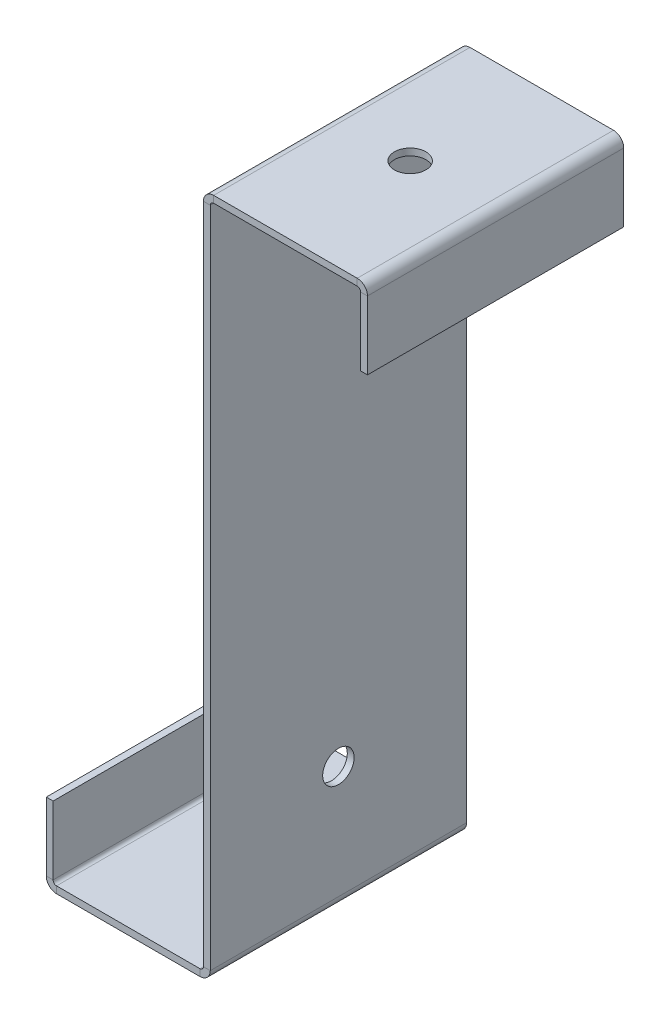
ISO-10303-21;
HEADER;
FILE_DESCRIPTION(('STEP AP214'),'2;1');
FILE_NAME('part.step','',(''),(''),'','','');
FILE_SCHEMA(('AUTOMOTIVE_DESIGN { 1 0 10303 214 1 1 1 1 }'));
ENDSEC;
DATA;
#1=APPLICATION_CONTEXT('core data for automotive mechanical design processes');
#2=APPLICATION_PROTOCOL_DEFINITION('international standard','automotive_design',2000,#1);
#3=PRODUCT_CONTEXT('',#1,'mechanical');
#4=PRODUCT('Part','Part','',(#3));
#5=PRODUCT_RELATED_PRODUCT_CATEGORY('part','',(#4));
#6=PRODUCT_DEFINITION_FORMATION('','',#4);
#7=PRODUCT_DEFINITION_CONTEXT('part definition',#1,'design');
#8=PRODUCT_DEFINITION('design','',#6,#7);
#9=PRODUCT_DEFINITION_SHAPE('','',#8);
#10=(LENGTH_UNIT() NAMED_UNIT(*) SI_UNIT(.MILLI.,.METRE.));
#11=(NAMED_UNIT(*) PLANE_ANGLE_UNIT() SI_UNIT($,.RADIAN.));
#12=(NAMED_UNIT(*) SI_UNIT($,.STERADIAN.) SOLID_ANGLE_UNIT());
#13=UNCERTAINTY_MEASURE_WITH_UNIT(LENGTH_MEASURE(1.E-05),#10,'distance_accuracy_value','');
#14=(GEOMETRIC_REPRESENTATION_CONTEXT(3) GLOBAL_UNCERTAINTY_ASSIGNED_CONTEXT((#13)) GLOBAL_UNIT_ASSIGNED_CONTEXT((#10,
#11,#12)) REPRESENTATION_CONTEXT('',''));
#15=CARTESIAN_POINT('',(0.,0.,0.));
#16=DIRECTION('',(0.,0.,1.));
#17=DIRECTION('',(1.,0.,0.));
#18=AXIS2_PLACEMENT_3D('',#15,#16,#17);
#19=CARTESIAN_POINT('',(-1.99999999999999,-100.,37.5));
#20=DIRECTION('',(0.,0.,1.));
#21=DIRECTION('',(1.,0.,0.));
#22=AXIS2_PLACEMENT_3D('',#19,#20,#21);
#23=PLANE('',#22);
#24=DIRECTION('',(-1.,0.,0.));
#25=VECTOR('',#24,1.);
#26=CARTESIAN_POINT('',(3.56372540173496E-13,-98.,37.5));
#27=LINE('',#26,#25);
#28=CARTESIAN_POINT('',(-45.,-98.0000000000001,37.5));
#29=VERTEX_POINT('',#28);
#30=CARTESIAN_POINT('',(-3.,-98.,37.5));
#31=VERTEX_POINT('',#30);
#32=EDGE_CURVE('E379',#29,#31,#27,.F.);
#33=ORIENTED_EDGE('',*,*,#32,.F.);
#34=DIRECTION('',(0.,-1.,0.));
#35=VECTOR('',#34,1.);
#36=CARTESIAN_POINT('',(-45.,-98.0000000000001,37.5));
#37=LINE('',#36,#35);
#38=CARTESIAN_POINT('',(-45.,-100.,37.5));
#39=VERTEX_POINT('',#38);
#40=EDGE_CURVE('E309',#29,#39,#37,.T.);
#41=ORIENTED_EDGE('',*,*,#40,.T.);
#42=DIRECTION('',(1.,0.,0.));
#43=VECTOR('',#42,1.);
#44=CARTESIAN_POINT('',(-1.99999999999999,-100.,37.5));
#45=LINE('',#44,#43);
#46=CARTESIAN_POINT('',(-3.,-100.,37.5));
#47=VERTEX_POINT('',#46);
#48=EDGE_CURVE('E373',#39,#47,#45,.T.);
#49=ORIENTED_EDGE('',*,*,#48,.T.);
#50=DIRECTION('',(0.,-1.,0.));
#51=VECTOR('',#50,1.);
#52=CARTESIAN_POINT('',(-3.,-98.,37.5));
#53=LINE('',#52,#51);
#54=EDGE_CURVE('E387',#31,#47,#53,.T.);
#55=ORIENTED_EDGE('',*,*,#54,.F.);
#56=EDGE_LOOP('',(#33,#41,#49,#55));
#57=FACE_BOUND('',#56,.T.);
#58=ADVANCED_FACE('F119',(#57),#23,.T.);
#59=CARTESIAN_POINT('',(3.69012209838063E-13,-100.,0.));
#60=DIRECTION('',(0.,-1.,0.));
#61=DIRECTION('',(1.,0.,0.));
#62=AXIS2_PLACEMENT_3D('',#59,#60,#61);
#63=PLANE('',#62);
#64=CARTESIAN_POINT('',(-23.,-100.,0.));
#65=DIRECTION('',(0.,-1.,0.));
#66=DIRECTION('',(1.,0.,0.));
#67=AXIS2_PLACEMENT_3D('',#64,#65,#66);
#68=CIRCLE('',#67,4.6);
#69=CARTESIAN_POINT('',(-18.4,-100.,0.));
#70=VERTEX_POINT('',#69);
#71=EDGE_CURVE('E1007',#70,#70,#68,.T.);
#72=ORIENTED_EDGE('',*,*,#71,.F.);
#73=EDGE_LOOP('',(#72));
#74=FACE_BOUND('',#73,.T.);
#75=ORIENTED_EDGE('',*,*,#48,.F.);
#76=DIRECTION('',(0.,0.,1.));
#77=VECTOR('',#76,1.);
#78=CARTESIAN_POINT('',(-45.,-100.,37.5));
#79=LINE('',#78,#77);
#80=CARTESIAN_POINT('',(-45.,-100.,-37.5));
#81=VERTEX_POINT('',#80);
#82=EDGE_CURVE('E264',#39,#81,#79,.F.);
#83=ORIENTED_EDGE('',*,*,#82,.T.);
#84=DIRECTION('',(-1.,0.,0.));
#85=VECTOR('',#84,1.);
#86=CARTESIAN_POINT('',(-48.,-100.,-37.5));
#87=LINE('',#86,#85);
#88=CARTESIAN_POINT('',(-3.,-100.,-37.5));
#89=VERTEX_POINT('',#88);
#90=EDGE_CURVE('E376',#89,#81,#87,.T.);
#91=ORIENTED_EDGE('',*,*,#90,.F.);
#92=DIRECTION('',(0.,0.,1.));
#93=VECTOR('',#92,1.);
#94=CARTESIAN_POINT('',(-3.,-100.,0.));
#95=LINE('',#94,#93);
#96=EDGE_CURVE('E384',#89,#47,#95,.T.);
#97=ORIENTED_EDGE('',*,*,#96,.T.);
#98=EDGE_LOOP('',(#75,#83,#91,#97));
#99=FACE_BOUND('',#98,.T.);
#100=ADVANCED_FACE('F549',(#74,#99),#63,.T.);
#101=CARTESIAN_POINT('',(3.62029247160377E-13,-98.,0.));
#102=DIRECTION('',(0.,-1.,0.));
#103=DIRECTION('',(1.,0.,0.));
#104=AXIS2_PLACEMENT_3D('',#101,#102,#103);
#105=PLANE('',#104);
#106=CARTESIAN_POINT('',(-23.,-98.0000000000001,0.));
#107=DIRECTION('',(0.,1.,0.));
#108=DIRECTION('',(-1.,0.,0.));
#109=AXIS2_PLACEMENT_3D('',#106,#107,#108);
#110=CIRCLE('',#109,4.6);
#111=CARTESIAN_POINT('',(-27.6,-98.0000000000001,0.));
#112=VERTEX_POINT('',#111);
#113=EDGE_CURVE('E992',#112,#112,#110,.T.);
#114=ORIENTED_EDGE('',*,*,#113,.F.);
#115=EDGE_LOOP('',(#114));
#116=FACE_BOUND('',#115,.T.);
#117=DIRECTION('',(0.,0.,1.));
#118=VECTOR('',#117,1.);
#119=CARTESIAN_POINT('',(-45.,-98.0000000000001,37.5));
#120=LINE('',#119,#118);
#121=CARTESIAN_POINT('',(-45.,-98.0000000000001,-37.5));
#122=VERTEX_POINT('',#121);
#123=EDGE_CURVE('E313',#29,#122,#120,.F.);
#124=ORIENTED_EDGE('',*,*,#123,.F.);
#125=ORIENTED_EDGE('',*,*,#32,.T.);
#126=DIRECTION('',(0.,0.,-1.));
#127=VECTOR('',#126,1.);
#128=CARTESIAN_POINT('',(-3.,-98.,-37.5));
#129=LINE('',#128,#127);
#130=CARTESIAN_POINT('',(-3.,-98.,-37.5));
#131=VERTEX_POINT('',#130);
#132=EDGE_CURVE('E390',#131,#31,#129,.F.);
#133=ORIENTED_EDGE('',*,*,#132,.F.);
#134=DIRECTION('',(1.,0.,0.));
#135=VECTOR('',#134,1.);
#136=CARTESIAN_POINT('',(3.67685954147258E-13,-98.,-37.5));
#137=LINE('',#136,#135);
#138=EDGE_CURVE('E381',#131,#122,#137,.F.);
#139=ORIENTED_EDGE('',*,*,#138,.T.);
#140=EDGE_LOOP('',(#124,#125,#133,#139));
#141=FACE_BOUND('',#140,.T.);
#142=ADVANCED_FACE('F572',(#116,#141),#105,.F.);
#143=CARTESIAN_POINT('',(0.,100.,-37.5));
#144=DIRECTION('',(0.,0.,1.));
#145=DIRECTION('',(1.,0.,0.));
#146=AXIS2_PLACEMENT_3D('',#143,#144,#145);
#147=PLANE('',#146);
#148=DIRECTION('',(0.,1.,0.));
#149=VECTOR('',#148,1.);
#150=CARTESIAN_POINT('',(43.,98.0000000000001,-37.5));
#151=LINE('',#150,#149);
#152=CARTESIAN_POINT('',(43.,98.0000000000001,-37.5));
#153=VERTEX_POINT('',#152);
#154=CARTESIAN_POINT('',(43.,100.,-37.5));
#155=VERTEX_POINT('',#154);
#156=EDGE_CURVE('E367',#153,#155,#151,.T.);
#157=ORIENTED_EDGE('',*,*,#156,.F.);
#158=DIRECTION('',(1.,0.,0.));
#159=VECTOR('',#158,1.);
#160=CARTESIAN_POINT('',(0.,98.,-37.5));
#161=LINE('',#160,#159);
#162=CARTESIAN_POINT('',(1.,98.,-37.5));
#163=VERTEX_POINT('',#162);
#164=EDGE_CURVE('E425',#153,#163,#161,.F.);
#165=ORIENTED_EDGE('',*,*,#164,.T.);
#166=DIRECTION('',(0.,-1.,0.));
#167=VECTOR('',#166,1.);
#168=CARTESIAN_POINT('',(0.999999999999994,100.,-37.5));
#169=LINE('',#168,#167);
#170=CARTESIAN_POINT('',(0.999999999999994,100.,-37.5));
#171=VERTEX_POINT('',#170);
#172=EDGE_CURVE('E415',#163,#171,#169,.F.);
#173=ORIENTED_EDGE('',*,*,#172,.T.);
#174=DIRECTION('',(-1.,0.,0.));
#175=VECTOR('',#174,1.);
#176=CARTESIAN_POINT('',(-3.74668916824944E-13,100.,-37.5));
#177=LINE('',#176,#175);
#178=EDGE_CURVE('E421',#155,#171,#177,.T.);
#179=ORIENTED_EDGE('',*,*,#178,.F.);
#180=EDGE_LOOP('',(#157,#165,#173,#179));
#181=FACE_BOUND('',#180,.T.);
#182=ADVANCED_FACE('F517',(#181),#147,.F.);
#183=CARTESIAN_POINT('',(46.,100.,37.5));
#184=DIRECTION('',(0.,0.,-1.));
#185=DIRECTION('',(-1.,0.,0.));
#186=AXIS2_PLACEMENT_3D('',#183,#184,#185);
#187=PLANE('',#186);
#188=DIRECTION('',(0.,1.,0.));
#189=VECTOR('',#188,1.);
#190=CARTESIAN_POINT('',(43.,98.0000000000001,37.5));
#191=LINE('',#190,#189);
#192=CARTESIAN_POINT('',(43.,98.0000000000002,37.5));
#193=VERTEX_POINT('',#192);
#194=CARTESIAN_POINT('',(43.,100.,37.5));
#195=VERTEX_POINT('',#194);
#196=EDGE_CURVE('E358',#193,#195,#191,.T.);
#197=ORIENTED_EDGE('',*,*,#196,.T.);
#198=DIRECTION('',(1.,0.,0.));
#199=VECTOR('',#198,1.);
#200=CARTESIAN_POINT('',(-3.69012209838063E-13,100.,37.5));
#201=LINE('',#200,#199);
#202=CARTESIAN_POINT('',(0.999999999999994,100.,37.5));
#203=VERTEX_POINT('',#202);
#204=EDGE_CURVE('E418',#203,#195,#201,.T.);
#205=ORIENTED_EDGE('',*,*,#204,.F.);
#206=DIRECTION('',(0.,-1.,0.));
#207=VECTOR('',#206,1.);
#208=CARTESIAN_POINT('',(1.,98.,37.5));
#209=LINE('',#208,#207);
#210=CARTESIAN_POINT('',(1.,98.,37.5));
#211=VERTEX_POINT('',#210);
#212=EDGE_CURVE('E430',#211,#203,#209,.F.);
#213=ORIENTED_EDGE('',*,*,#212,.F.);
#214=DIRECTION('',(-1.,0.,0.));
#215=VECTOR('',#214,1.);
#216=CARTESIAN_POINT('',(46.,98.0000000000002,37.5));
#217=LINE('',#216,#215);
#218=EDGE_CURVE('E423',#211,#193,#217,.F.);
#219=ORIENTED_EDGE('',*,*,#218,.T.);
#220=EDGE_LOOP('',(#197,#205,#213,#219));
#221=FACE_BOUND('',#220,.T.);
#222=ADVANCED_FACE('F482',(#221),#187,.F.);
#223=CARTESIAN_POINT('',(-3.69012209838063E-13,100.,0.));
#224=DIRECTION('',(0.,-1.,0.));
#225=DIRECTION('',(1.,0.,0.));
#226=AXIS2_PLACEMENT_3D('',#223,#224,#225);
#227=PLANE('',#226);
#228=CARTESIAN_POINT('',(21.,100.,0.));
#229=DIRECTION('',(0.,1.,0.));
#230=DIRECTION('',(-1.,0.,0.));
#231=AXIS2_PLACEMENT_3D('',#228,#229,#230);
#232=CIRCLE('',#231,4.6);
#233=CARTESIAN_POINT('',(16.4,100.,0.));
#234=VERTEX_POINT('',#233);
#235=EDGE_CURVE('E1004',#234,#234,#232,.T.);
#236=ORIENTED_EDGE('',*,*,#235,.F.);
#237=EDGE_LOOP('',(#236));
#238=FACE_BOUND('',#237,.T.);
#239=DIRECTION('',(0.,0.,1.));
#240=VECTOR('',#239,1.);
#241=CARTESIAN_POINT('',(43.,100.,37.5));
#242=LINE('',#241,#240);
#243=EDGE_CURVE('E352',#195,#155,#242,.F.);
#244=ORIENTED_EDGE('',*,*,#243,.T.);
#245=ORIENTED_EDGE('',*,*,#178,.T.);
#246=DIRECTION('',(0.,0.,1.));
#247=VECTOR('',#246,1.);
#248=CARTESIAN_POINT('',(0.999999999999994,100.,-37.5));
#249=LINE('',#248,#247);
#250=EDGE_CURVE('E427',#203,#171,#249,.F.);
#251=ORIENTED_EDGE('',*,*,#250,.F.);
#252=ORIENTED_EDGE('',*,*,#204,.T.);
#253=EDGE_LOOP('',(#244,#245,#251,#252));
#254=FACE_BOUND('',#253,.T.);
#255=ADVANCED_FACE('F521',(#238,#254),#227,.F.);
#256=CARTESIAN_POINT('',(-3.62029247160377E-13,98.,0.));
#257=DIRECTION('',(0.,-1.,0.));
#258=DIRECTION('',(1.,0.,0.));
#259=AXIS2_PLACEMENT_3D('',#256,#257,#258);
#260=PLANE('',#259);
#261=CARTESIAN_POINT('',(21.,98.0000000000001,0.));
#262=DIRECTION('',(0.,-1.,0.));
#263=DIRECTION('',(1.,0.,0.));
#264=AXIS2_PLACEMENT_3D('',#261,#262,#263);
#265=CIRCLE('',#264,4.6);
#266=CARTESIAN_POINT('',(25.6,98.0000000000001,0.));
#267=VERTEX_POINT('',#266);
#268=EDGE_CURVE('E123',#267,#267,#265,.T.);
#269=ORIENTED_EDGE('',*,*,#268,.F.);
#270=EDGE_LOOP('',(#269));
#271=FACE_BOUND('',#270,.T.);
#272=ORIENTED_EDGE('',*,*,#164,.F.);
#273=DIRECTION('',(0.,0.,1.));
#274=VECTOR('',#273,1.);
#275=CARTESIAN_POINT('',(43.,98.0000000000001,37.5));
#276=LINE('',#275,#274);
#277=EDGE_CURVE('E144',#193,#153,#276,.F.);
#278=ORIENTED_EDGE('',*,*,#277,.F.);
#279=ORIENTED_EDGE('',*,*,#218,.F.);
#280=DIRECTION('',(0.,0.,1.));
#281=VECTOR('',#280,1.);
#282=CARTESIAN_POINT('',(1.,98.,-37.5));
#283=LINE('',#282,#281);
#284=EDGE_CURVE('E433',#163,#211,#283,.T.);
#285=ORIENTED_EDGE('',*,*,#284,.F.);
#286=EDGE_LOOP('',(#272,#278,#279,#285));
#287=FACE_BOUND('',#286,.T.);
#288=ADVANCED_FACE('F479',(#271,#287),#260,.T.);
#289=CARTESIAN_POINT('',(-2.,100.,37.5));
#290=DIRECTION('',(0.,0.,1.));
#291=DIRECTION('',(0.,-1.,0.));
#292=AXIS2_PLACEMENT_3D('',#289,#290,#291);
#293=PLANE('',#292);
#294=DIRECTION('',(0.,-1.,0.));
#295=VECTOR('',#294,1.);
#296=CARTESIAN_POINT('',(-2.,100.,37.5));
#297=LINE('',#296,#295);
#298=CARTESIAN_POINT('',(-2.,97.,37.5));
#299=VERTEX_POINT('',#298);
#300=CARTESIAN_POINT('',(-2.00000000000001,-97.,37.5));
#301=VERTEX_POINT('',#300);
#302=EDGE_CURVE('E13',#299,#301,#297,.T.);
#303=ORIENTED_EDGE('',*,*,#302,.T.);
#304=DIRECTION('',(1.,0.,0.));
#305=VECTOR('',#304,1.);
#306=CARTESIAN_POINT('',(-2.00000000000001,-97.,37.5));
#307=LINE('',#306,#305);
#308=CARTESIAN_POINT('',(0.,-97.,37.5));
#309=VERTEX_POINT('',#308);
#310=EDGE_CURVE('E402',#301,#309,#307,.T.);
#311=ORIENTED_EDGE('',*,*,#310,.T.);
#312=DIRECTION('',(0.,-1.,0.));
#313=VECTOR('',#312,1.);
#314=CARTESIAN_POINT('',(0.,100.,37.5));
#315=LINE('',#314,#313);
#316=CARTESIAN_POINT('',(0.,97.,37.5));
#317=VERTEX_POINT('',#316);
#318=EDGE_CURVE('E461',#317,#309,#315,.T.);
#319=ORIENTED_EDGE('',*,*,#318,.F.);
#320=DIRECTION('',(-1.,0.,0.));
#321=VECTOR('',#320,1.);
#322=CARTESIAN_POINT('',(0.,97.,37.5));
#323=LINE('',#322,#321);
#324=EDGE_CURVE('E444',#317,#299,#323,.T.);
#325=ORIENTED_EDGE('',*,*,#324,.T.);
#326=EDGE_LOOP('',(#303,#311,#319,#325));
#327=FACE_BOUND('',#326,.T.);
#328=ADVANCED_FACE('F469',(#327),#293,.T.);
#329=CARTESIAN_POINT('',(-2.,0.,0.));
#330=DIRECTION('',(1.,0.,0.));
#331=DIRECTION('',(0.,0.,-1.));
#332=AXIS2_PLACEMENT_3D('',#329,#330,#331);
#333=PLANE('',#332);
#334=CARTESIAN_POINT('',(-2.,-64.,0.));
#335=DIRECTION('',(1.,0.,0.));
#336=DIRECTION('',(0.,0.,-1.));
#337=AXIS2_PLACEMENT_3D('',#334,#335,#336);
#338=CIRCLE('',#337,4.6);
#339=CARTESIAN_POINT('',(-2.,-64.,-4.60000000000001));
#340=VERTEX_POINT('',#339);
#341=EDGE_CURVE('E1011',#340,#340,#338,.T.);
#342=ORIENTED_EDGE('',*,*,#341,.T.);
#343=EDGE_LOOP('',(#342));
#344=FACE_BOUND('',#343,.T.);
#345=DIRECTION('',(0.,0.,1.));
#346=VECTOR('',#345,1.);
#347=CARTESIAN_POINT('',(-2.00000000000001,-97.,37.5));
#348=LINE('',#347,#346);
#349=CARTESIAN_POINT('',(-2.00000000000001,-97.,-37.5));
#350=VERTEX_POINT('',#349);
#351=EDGE_CURVE('E408',#301,#350,#348,.F.);
#352=ORIENTED_EDGE('',*,*,#351,.F.);
#353=ORIENTED_EDGE('',*,*,#302,.F.);
#354=DIRECTION('',(0.,0.,1.));
#355=VECTOR('',#354,1.);
#356=CARTESIAN_POINT('',(-2.,97.,37.5));
#357=LINE('',#356,#355);
#358=CARTESIAN_POINT('',(-2.,97.,-37.5));
#359=VERTEX_POINT('',#358);
#360=EDGE_CURVE('E437',#299,#359,#357,.F.);
#361=ORIENTED_EDGE('',*,*,#360,.T.);
#362=DIRECTION('',(0.,1.,0.));
#363=VECTOR('',#362,1.);
#364=CARTESIAN_POINT('',(-2.,100.,-37.5));
#365=LINE('',#364,#363);
#366=EDGE_CURVE('E128',#350,#359,#365,.T.);
#367=ORIENTED_EDGE('',*,*,#366,.F.);
#368=EDGE_LOOP('',(#352,#353,#361,#367));
#369=FACE_BOUND('',#368,.T.);
#370=ADVANCED_FACE('F534',(#344,#369),#333,.F.);
#371=CARTESIAN_POINT('',(0.,0.,0.));
#372=DIRECTION('',(1.,0.,0.));
#373=DIRECTION('',(0.,0.,-1.));
#374=AXIS2_PLACEMENT_3D('',#371,#372,#373);
#375=PLANE('',#374);
#376=CARTESIAN_POINT('',(0.,-64.,0.));
#377=DIRECTION('',(1.,0.,0.));
#378=DIRECTION('',(0.,0.,-1.));
#379=AXIS2_PLACEMENT_3D('',#376,#377,#378);
#380=CIRCLE('',#379,4.6);
#381=CARTESIAN_POINT('',(0.,-64.,-4.60000000000001));
#382=VERTEX_POINT('',#381);
#383=EDGE_CURVE('E1014',#382,#382,#380,.T.);
#384=ORIENTED_EDGE('',*,*,#383,.F.);
#385=EDGE_LOOP('',(#384));
#386=FACE_BOUND('',#385,.T.);
#387=ORIENTED_EDGE('',*,*,#318,.T.);
#388=DIRECTION('',(0.,0.,1.));
#389=VECTOR('',#388,1.);
#390=CARTESIAN_POINT('',(0.,-97.,37.5));
#391=LINE('',#390,#389);
#392=CARTESIAN_POINT('',(0.,-97.,-37.5));
#393=VERTEX_POINT('',#392);
#394=EDGE_CURVE('E395',#309,#393,#391,.F.);
#395=ORIENTED_EDGE('',*,*,#394,.T.);
#396=DIRECTION('',(0.,1.,0.));
#397=VECTOR('',#396,1.);
#398=CARTESIAN_POINT('',(0.,100.,-37.5));
#399=LINE('',#398,#397);
#400=CARTESIAN_POINT('',(0.,97.,-37.5));
#401=VERTEX_POINT('',#400);
#402=EDGE_CURVE('E458',#393,#401,#399,.T.);
#403=ORIENTED_EDGE('',*,*,#402,.T.);
#404=DIRECTION('',(0.,0.,1.));
#405=VECTOR('',#404,1.);
#406=CARTESIAN_POINT('',(0.,97.,37.5));
#407=LINE('',#406,#405);
#408=EDGE_CURVE('E450',#317,#401,#407,.F.);
#409=ORIENTED_EDGE('',*,*,#408,.F.);
#410=EDGE_LOOP('',(#387,#395,#403,#409));
#411=FACE_BOUND('',#410,.T.);
#412=ADVANCED_FACE('F466',(#386,#411),#375,.T.);
#413=CARTESIAN_POINT('',(-2.,100.,-37.5));
#414=DIRECTION('',(0.,0.,-1.));
#415=DIRECTION('',(0.,1.,0.));
#416=AXIS2_PLACEMENT_3D('',#413,#414,#415);
#417=PLANE('',#416);
#418=DIRECTION('',(1.,0.,0.));
#419=VECTOR('',#418,1.);
#420=CARTESIAN_POINT('',(-2.00000000000001,-97.,-37.5));
#421=LINE('',#420,#419);
#422=EDGE_CURVE('E412',#350,#393,#421,.T.);
#423=ORIENTED_EDGE('',*,*,#422,.F.);
#424=ORIENTED_EDGE('',*,*,#366,.T.);
#425=DIRECTION('',(-1.,0.,0.));
#426=VECTOR('',#425,1.);
#427=CARTESIAN_POINT('',(0.,97.,-37.5));
#428=LINE('',#427,#426);
#429=EDGE_CURVE('E455',#401,#359,#428,.T.);
#430=ORIENTED_EDGE('',*,*,#429,.F.);
#431=ORIENTED_EDGE('',*,*,#402,.F.);
#432=EDGE_LOOP('',(#423,#424,#430,#431));
#433=FACE_BOUND('',#432,.T.);
#434=ADVANCED_FACE('F121',(#433),#417,.T.);
#435=CARTESIAN_POINT('',(1.,97.,-37.5));
#436=DIRECTION('',(0.,0.,-1.));
#437=DIRECTION('',(-1.,0.,0.));
#438=AXIS2_PLACEMENT_3D('',#435,#436,#437);
#439=PLANE('',#438);
#440=ORIENTED_EDGE('',*,*,#172,.F.);
#441=CARTESIAN_POINT('',(1.,97.,-37.5));
#442=DIRECTION('',(0.,0.,1.));
#443=DIRECTION('',(1.,0.,0.));
#444=AXIS2_PLACEMENT_3D('',#441,#442,#443);
#445=CIRCLE('',#444,1.);
#446=EDGE_CURVE('E447',#401,#163,#445,.F.);
#447=ORIENTED_EDGE('',*,*,#446,.F.);
#448=ORIENTED_EDGE('',*,*,#429,.T.);
#449=CARTESIAN_POINT('',(1.,97.,-37.5));
#450=DIRECTION('',(0.,0.,1.));
#451=DIRECTION('',(1.,0.,0.));
#452=AXIS2_PLACEMENT_3D('',#449,#450,#451);
#453=CIRCLE('',#452,3.);
#454=EDGE_CURVE('E440',#359,#171,#453,.F.);
#455=ORIENTED_EDGE('',*,*,#454,.T.);
#456=EDGE_LOOP('',(#440,#447,#448,#455));
#457=FACE_BOUND('',#456,.T.);
#458=ADVANCED_FACE('F526',(#457),#439,.T.);
#459=CARTESIAN_POINT('',(1.,97.,37.5));
#460=DIRECTION('',(0.,0.,-1.));
#461=DIRECTION('',(-1.,0.,0.));
#462=AXIS2_PLACEMENT_3D('',#459,#460,#461);
#463=PLANE('',#462);
#464=CARTESIAN_POINT('',(1.,97.,37.5));
#465=DIRECTION('',(0.,0.,1.));
#466=DIRECTION('',(1.,0.,0.));
#467=AXIS2_PLACEMENT_3D('',#464,#465,#466);
#468=CIRCLE('',#467,1.);
#469=EDGE_CURVE('E420',#211,#317,#468,.T.);
#470=ORIENTED_EDGE('',*,*,#469,.F.);
#471=ORIENTED_EDGE('',*,*,#212,.T.);
#472=CARTESIAN_POINT('',(1.,97.,37.5));
#473=DIRECTION('',(0.,0.,1.));
#474=DIRECTION('',(1.,0.,0.));
#475=AXIS2_PLACEMENT_3D('',#472,#473,#474);
#476=CIRCLE('',#475,3.);
#477=EDGE_CURVE('E441',#203,#299,#476,.T.);
#478=ORIENTED_EDGE('',*,*,#477,.T.);
#479=ORIENTED_EDGE('',*,*,#324,.F.);
#480=EDGE_LOOP('',(#470,#471,#478,#479));
#481=FACE_BOUND('',#480,.T.);
#482=ADVANCED_FACE('F473',(#481),#463,.F.);
#483=CARTESIAN_POINT('',(1.,97.,37.5));
#484=DIRECTION('',(0.,0.,1.));
#485=DIRECTION('',(0.,1.,0.));
#486=AXIS2_PLACEMENT_3D('',#483,#484,#485);
#487=CYLINDRICAL_SURFACE('',#486,3.);
#488=ORIENTED_EDGE('',*,*,#360,.F.);
#489=ORIENTED_EDGE('',*,*,#477,.F.);
#490=ORIENTED_EDGE('',*,*,#250,.T.);
#491=ORIENTED_EDGE('',*,*,#454,.F.);
#492=EDGE_LOOP('',(#488,#489,#490,#491));
#493=FACE_BOUND('',#492,.T.);
#494=ADVANCED_FACE('F524',(#493),#487,.T.);
#495=CARTESIAN_POINT('',(1.,97.,37.5));
#496=DIRECTION('',(0.,0.,1.));
#497=DIRECTION('',(0.,1.,0.));
#498=AXIS2_PLACEMENT_3D('',#495,#496,#497);
#499=CYLINDRICAL_SURFACE('',#498,1.);
#500=ORIENTED_EDGE('',*,*,#408,.T.);
#501=ORIENTED_EDGE('',*,*,#446,.T.);
#502=ORIENTED_EDGE('',*,*,#284,.T.);
#503=ORIENTED_EDGE('',*,*,#469,.T.);
#504=EDGE_LOOP('',(#500,#501,#502,#503));
#505=FACE_BOUND('',#504,.T.);
#506=ADVANCED_FACE('F476',(#505),#499,.F.);
#507=CARTESIAN_POINT('',(-3.00000000000001,-97.,-37.5));
#508=DIRECTION('',(0.,0.,-1.));
#509=DIRECTION('',(-1.,0.,0.));
#510=AXIS2_PLACEMENT_3D('',#507,#508,#509);
#511=PLANE('',#510);
#512=DIRECTION('',(0.,-1.,0.));
#513=VECTOR('',#512,1.);
#514=CARTESIAN_POINT('',(-3.,-100.,-37.5));
#515=LINE('',#514,#513);
#516=EDGE_CURVE('E370',#131,#89,#515,.T.);
#517=ORIENTED_EDGE('',*,*,#516,.F.);
#518=CARTESIAN_POINT('',(-3.00000000000001,-97.,-37.5));
#519=DIRECTION('',(0.,0.,1.));
#520=DIRECTION('',(1.,0.,0.));
#521=AXIS2_PLACEMENT_3D('',#518,#519,#520);
#522=CIRCLE('',#521,1.);
#523=EDGE_CURVE('E405',#350,#131,#522,.F.);
#524=ORIENTED_EDGE('',*,*,#523,.F.);
#525=ORIENTED_EDGE('',*,*,#422,.T.);
#526=CARTESIAN_POINT('',(-3.00000000000001,-97.,-37.5));
#527=DIRECTION('',(0.,0.,1.));
#528=DIRECTION('',(1.,0.,0.));
#529=AXIS2_PLACEMENT_3D('',#526,#527,#528);
#530=CIRCLE('',#529,3.);
#531=EDGE_CURVE('E398',#393,#89,#530,.F.);
#532=ORIENTED_EDGE('',*,*,#531,.T.);
#533=EDGE_LOOP('',(#517,#524,#525,#532));
#534=FACE_BOUND('',#533,.T.);
#535=ADVANCED_FACE('F541',(#534),#511,.T.);
#536=CARTESIAN_POINT('',(-3.00000000000001,-97.,37.5));
#537=DIRECTION('',(0.,0.,-1.));
#538=DIRECTION('',(-1.,0.,0.));
#539=AXIS2_PLACEMENT_3D('',#536,#537,#538);
#540=PLANE('',#539);
#541=CARTESIAN_POINT('',(-3.00000000000001,-97.,37.5));
#542=DIRECTION('',(0.,0.,1.));
#543=DIRECTION('',(1.,0.,0.));
#544=AXIS2_PLACEMENT_3D('',#541,#542,#543);
#545=CIRCLE('',#544,1.);
#546=EDGE_CURVE('E375',#31,#301,#545,.T.);
#547=ORIENTED_EDGE('',*,*,#546,.F.);
#548=ORIENTED_EDGE('',*,*,#54,.T.);
#549=CARTESIAN_POINT('',(-3.00000000000001,-97.,37.5));
#550=DIRECTION('',(0.,0.,1.));
#551=DIRECTION('',(1.,0.,0.));
#552=AXIS2_PLACEMENT_3D('',#549,#550,#551);
#553=CIRCLE('',#552,3.);
#554=EDGE_CURVE('E399',#47,#309,#553,.T.);
#555=ORIENTED_EDGE('',*,*,#554,.T.);
#556=ORIENTED_EDGE('',*,*,#310,.F.);
#557=EDGE_LOOP('',(#547,#548,#555,#556));
#558=FACE_BOUND('',#557,.T.);
#559=ADVANCED_FACE('F557',(#558),#540,.F.);
#560=CARTESIAN_POINT('',(-3.00000000000001,-97.,37.5));
#561=DIRECTION('',(0.,0.,1.));
#562=DIRECTION('',(0.,-1.,0.));
#563=AXIS2_PLACEMENT_3D('',#560,#561,#562);
#564=CYLINDRICAL_SURFACE('',#563,3.);
#565=ORIENTED_EDGE('',*,*,#394,.F.);
#566=ORIENTED_EDGE('',*,*,#554,.F.);
#567=ORIENTED_EDGE('',*,*,#96,.F.);
#568=ORIENTED_EDGE('',*,*,#531,.F.);
#569=EDGE_LOOP('',(#565,#566,#567,#568));
#570=FACE_BOUND('',#569,.T.);
#571=ADVANCED_FACE('F555',(#570),#564,.T.);
#572=CARTESIAN_POINT('',(-3.00000000000001,-97.,37.5));
#573=DIRECTION('',(0.,0.,1.));
#574=DIRECTION('',(0.,-1.,0.));
#575=AXIS2_PLACEMENT_3D('',#572,#573,#574);
#576=CYLINDRICAL_SURFACE('',#575,1.);
#577=ORIENTED_EDGE('',*,*,#351,.T.);
#578=ORIENTED_EDGE('',*,*,#523,.T.);
#579=ORIENTED_EDGE('',*,*,#132,.T.);
#580=ORIENTED_EDGE('',*,*,#546,.T.);
#581=EDGE_LOOP('',(#577,#578,#579,#580));
#582=FACE_BOUND('',#581,.T.);
#583=ADVANCED_FACE('F537',(#582),#576,.F.);
#584=CARTESIAN_POINT('',(-48.,-100.,-37.5));
#585=DIRECTION('',(0.,0.,-1.));
#586=DIRECTION('',(-1.,0.,0.));
#587=AXIS2_PLACEMENT_3D('',#584,#585,#586);
#588=PLANE('',#587);
#589=DIRECTION('',(0.,-1.,0.));
#590=VECTOR('',#589,1.);
#591=CARTESIAN_POINT('',(-45.,-98.0000000000001,-37.5));
#592=LINE('',#591,#590);
#593=EDGE_CURVE('E316',#122,#81,#592,.T.);
#594=ORIENTED_EDGE('',*,*,#593,.F.);
#595=ORIENTED_EDGE('',*,*,#138,.F.);
#596=ORIENTED_EDGE('',*,*,#516,.T.);
#597=ORIENTED_EDGE('',*,*,#90,.T.);
#598=EDGE_LOOP('',(#594,#595,#596,#597));
#599=FACE_BOUND('',#598,.T.);
#600=ADVANCED_FACE('F546',(#599),#588,.T.);
#601=CARTESIAN_POINT('',(43.,97.0000000000001,-37.5));
#602=DIRECTION('',(0.,0.,-1.));
#603=DIRECTION('',(-1.,0.,0.));
#604=AXIS2_PLACEMENT_3D('',#601,#602,#603);
#605=PLANE('',#604);
#606=DIRECTION('',(1.,0.,0.));
#607=VECTOR('',#606,1.);
#608=CARTESIAN_POINT('',(46.,97.0000000000002,-37.5));
#609=LINE('',#608,#607);
#610=CARTESIAN_POINT('',(44.,97.0000000000002,-37.5));
#611=VERTEX_POINT('',#610);
#612=CARTESIAN_POINT('',(46.,97.0000000000002,-37.5));
#613=VERTEX_POINT('',#612);
#614=EDGE_CURVE('E318',#611,#613,#609,.T.);
#615=ORIENTED_EDGE('',*,*,#614,.F.);
#616=CARTESIAN_POINT('',(43.,97.0000000000001,-37.5));
#617=DIRECTION('',(0.,0.,1.));
#618=DIRECTION('',(1.,0.,0.));
#619=AXIS2_PLACEMENT_3D('',#616,#617,#618);
#620=CIRCLE('',#619,0.999999999999994);
#621=EDGE_CURVE('E361',#153,#611,#620,.F.);
#622=ORIENTED_EDGE('',*,*,#621,.F.);
#623=ORIENTED_EDGE('',*,*,#156,.T.);
#624=CARTESIAN_POINT('',(43.,97.0000000000001,-37.5));
#625=DIRECTION('',(0.,0.,1.));
#626=DIRECTION('',(1.,0.,0.));
#627=AXIS2_PLACEMENT_3D('',#624,#625,#626);
#628=CIRCLE('',#627,2.99999999999999);
#629=EDGE_CURVE('E354',#155,#613,#628,.F.);
#630=ORIENTED_EDGE('',*,*,#629,.T.);
#631=EDGE_LOOP('',(#615,#622,#623,#630));
#632=FACE_BOUND('',#631,.T.);
#633=ADVANCED_FACE('F514',(#632),#605,.T.);
#634=CARTESIAN_POINT('',(43.,97.0000000000001,37.5));
#635=DIRECTION('',(0.,0.,-1.));
#636=DIRECTION('',(-1.,0.,0.));
#637=AXIS2_PLACEMENT_3D('',#634,#635,#636);
#638=PLANE('',#637);
#639=CARTESIAN_POINT('',(43.,97.0000000000001,37.5));
#640=DIRECTION('',(0.,0.,1.));
#641=DIRECTION('',(1.,0.,0.));
#642=AXIS2_PLACEMENT_3D('',#639,#640,#641);
#643=CIRCLE('',#642,0.999999999999994);
#644=CARTESIAN_POINT('',(44.,97.0000000000002,37.5));
#645=VERTEX_POINT('',#644);
#646=EDGE_CURVE('E322',#645,#193,#643,.T.);
#647=ORIENTED_EDGE('',*,*,#646,.F.);
#648=DIRECTION('',(1.,0.,0.));
#649=VECTOR('',#648,1.);
#650=CARTESIAN_POINT('',(44.,97.0000000000002,37.5));
#651=LINE('',#650,#649);
#652=CARTESIAN_POINT('',(46.,97.0000000000002,37.5));
#653=VERTEX_POINT('',#652);
#654=EDGE_CURVE('E345',#645,#653,#651,.T.);
#655=ORIENTED_EDGE('',*,*,#654,.T.);
#656=CARTESIAN_POINT('',(43.,97.0000000000001,37.5));
#657=DIRECTION('',(0.,0.,1.));
#658=DIRECTION('',(1.,0.,0.));
#659=AXIS2_PLACEMENT_3D('',#656,#657,#658);
#660=CIRCLE('',#659,2.99999999999999);
#661=EDGE_CURVE('E355',#653,#195,#660,.T.);
#662=ORIENTED_EDGE('',*,*,#661,.T.);
#663=ORIENTED_EDGE('',*,*,#196,.F.);
#664=EDGE_LOOP('',(#647,#655,#662,#663));
#665=FACE_BOUND('',#664,.T.);
#666=ADVANCED_FACE('F487',(#665),#638,.F.);
#667=CARTESIAN_POINT('',(43.,97.0000000000001,37.5));
#668=DIRECTION('',(0.,0.,1.));
#669=DIRECTION('',(1.,0.,0.));
#670=AXIS2_PLACEMENT_3D('',#667,#668,#669);
#671=CYLINDRICAL_SURFACE('',#670,2.99999999999999);
#672=ORIENTED_EDGE('',*,*,#243,.F.);
#673=ORIENTED_EDGE('',*,*,#661,.F.);
#674=DIRECTION('',(0.,0.,1.));
#675=VECTOR('',#674,1.);
#676=CARTESIAN_POINT('',(46.,97.0000000000002,0.));
#677=LINE('',#676,#675);
#678=EDGE_CURVE('E342',#613,#653,#677,.T.);
#679=ORIENTED_EDGE('',*,*,#678,.F.);
#680=ORIENTED_EDGE('',*,*,#629,.F.);
#681=EDGE_LOOP('',(#672,#673,#679,#680));
#682=FACE_BOUND('',#681,.T.);
#683=ADVANCED_FACE('F512',(#682),#671,.T.);
#684=CARTESIAN_POINT('',(43.,97.0000000000001,37.5));
#685=DIRECTION('',(0.,0.,1.));
#686=DIRECTION('',(1.,0.,0.));
#687=AXIS2_PLACEMENT_3D('',#684,#685,#686);
#688=CYLINDRICAL_SURFACE('',#687,0.999999999999994);
#689=ORIENTED_EDGE('',*,*,#277,.T.);
#690=ORIENTED_EDGE('',*,*,#621,.T.);
#691=DIRECTION('',(0.,0.,-1.));
#692=VECTOR('',#691,1.);
#693=CARTESIAN_POINT('',(44.,97.0000000000002,-37.5));
#694=LINE('',#693,#692);
#695=EDGE_CURVE('E348',#611,#645,#694,.F.);
#696=ORIENTED_EDGE('',*,*,#695,.T.);
#697=ORIENTED_EDGE('',*,*,#646,.T.);
#698=EDGE_LOOP('',(#689,#690,#696,#697));
#699=FACE_BOUND('',#698,.T.);
#700=ADVANCED_FACE('F489',(#699),#688,.F.);
#701=CARTESIAN_POINT('',(46.,98.0000000000002,37.5));
#702=DIRECTION('',(0.,0.,1.));
#703=DIRECTION('',(1.,0.,0.));
#704=AXIS2_PLACEMENT_3D('',#701,#702,#703);
#705=PLANE('',#704);
#706=DIRECTION('',(0.,1.,0.));
#707=VECTOR('',#706,1.);
#708=CARTESIAN_POINT('',(46.,98.0000000000002,37.5));
#709=LINE('',#708,#707);
#710=CARTESIAN_POINT('',(46.0000000000002,77.0000000000002,37.5));
#711=VERTEX_POINT('',#710);
#712=EDGE_CURVE('E326',#711,#653,#709,.T.);
#713=ORIENTED_EDGE('',*,*,#712,.T.);
#714=ORIENTED_EDGE('',*,*,#654,.F.);
#715=DIRECTION('',(0.,-1.,0.));
#716=VECTOR('',#715,1.);
#717=CARTESIAN_POINT('',(44.0000000000007,3.27148016521279E-13,37.5));
#718=LINE('',#717,#716);
#719=CARTESIAN_POINT('',(44.0000000000002,77.0000000000001,37.5));
#720=VERTEX_POINT('',#719);
#721=EDGE_CURVE('E334',#720,#645,#718,.F.);
#722=ORIENTED_EDGE('',*,*,#721,.F.);
#723=DIRECTION('',(-1.,0.,0.));
#724=VECTOR('',#723,1.);
#725=CARTESIAN_POINT('',(46.0000000000002,77.0000000000002,37.5));
#726=LINE('',#725,#724);
#727=EDGE_CURVE('E320',#711,#720,#726,.T.);
#728=ORIENTED_EDGE('',*,*,#727,.F.);
#729=EDGE_LOOP('',(#713,#714,#722,#728));
#730=FACE_BOUND('',#729,.T.);
#731=ADVANCED_FACE('F506',(#730),#705,.T.);
#732=CARTESIAN_POINT('',(46.0000000000002,77.0000000000002,-37.5));
#733=DIRECTION('',(0.,0.,-1.));
#734=DIRECTION('',(-1.,0.,0.));
#735=AXIS2_PLACEMENT_3D('',#732,#733,#734);
#736=PLANE('',#735);
#737=DIRECTION('',(0.,1.,0.));
#738=VECTOR('',#737,1.);
#739=CARTESIAN_POINT('',(44.0000000000007,3.27148016521279E-13,-37.5));
#740=LINE('',#739,#738);
#741=CARTESIAN_POINT('',(44.0000000000002,77.0000000000001,-37.5));
#742=VERTEX_POINT('',#741);
#743=EDGE_CURVE('E340',#611,#742,#740,.F.);
#744=ORIENTED_EDGE('',*,*,#743,.F.);
#745=ORIENTED_EDGE('',*,*,#614,.T.);
#746=DIRECTION('',(0.,-1.,0.));
#747=VECTOR('',#746,1.);
#748=CARTESIAN_POINT('',(46.0000000000002,77.0000000000002,-37.5));
#749=LINE('',#748,#747);
#750=CARTESIAN_POINT('',(46.0000000000002,77.0000000000002,-37.5));
#751=VERTEX_POINT('',#750);
#752=EDGE_CURVE('E332',#613,#751,#749,.T.);
#753=ORIENTED_EDGE('',*,*,#752,.T.);
#754=DIRECTION('',(-1.,0.,0.));
#755=VECTOR('',#754,1.);
#756=CARTESIAN_POINT('',(46.0000000000002,77.0000000000002,-37.5));
#757=LINE('',#756,#755);
#758=EDGE_CURVE('E323',#751,#742,#757,.T.);
#759=ORIENTED_EDGE('',*,*,#758,.T.);
#760=EDGE_LOOP('',(#744,#745,#753,#759));
#761=FACE_BOUND('',#760,.T.);
#762=ADVANCED_FACE('F498',(#761),#736,.T.);
#763=CARTESIAN_POINT('',(46.0000000000007,3.41371564142173E-13,0.));
#764=DIRECTION('',(1.,0.,0.));
#765=DIRECTION('',(0.,1.,0.));
#766=AXIS2_PLACEMENT_3D('',#763,#764,#765);
#767=PLANE('',#766);
#768=ORIENTED_EDGE('',*,*,#752,.F.);
#769=ORIENTED_EDGE('',*,*,#678,.T.);
#770=ORIENTED_EDGE('',*,*,#712,.F.);
#771=DIRECTION('',(0.,0.,1.));
#772=VECTOR('',#771,1.);
#773=CARTESIAN_POINT('',(46.0000000000002,77.0000000000002,37.5));
#774=LINE('',#773,#772);
#775=EDGE_CURVE('E329',#751,#711,#774,.T.);
#776=ORIENTED_EDGE('',*,*,#775,.F.);
#777=EDGE_LOOP('',(#768,#769,#770,#776));
#778=FACE_BOUND('',#777,.T.);
#779=ADVANCED_FACE('F509',(#778),#767,.T.);
#780=CARTESIAN_POINT('',(44.0000000000007,3.27148016521279E-13,0.));
#781=DIRECTION('',(1.,0.,0.));
#782=DIRECTION('',(0.,1.,0.));
#783=AXIS2_PLACEMENT_3D('',#780,#781,#782);
#784=PLANE('',#783);
#785=ORIENTED_EDGE('',*,*,#695,.F.);
#786=ORIENTED_EDGE('',*,*,#743,.T.);
#787=DIRECTION('',(0.,0.,-1.));
#788=VECTOR('',#787,1.);
#789=CARTESIAN_POINT('',(44.0000000000002,77.0000000000001,0.));
#790=LINE('',#789,#788);
#791=EDGE_CURVE('E337',#742,#720,#790,.F.);
#792=ORIENTED_EDGE('',*,*,#791,.T.);
#793=ORIENTED_EDGE('',*,*,#721,.T.);
#794=EDGE_LOOP('',(#785,#786,#792,#793));
#795=FACE_BOUND('',#794,.T.);
#796=ADVANCED_FACE('F494',(#795),#784,.F.);
#797=CARTESIAN_POINT('',(46.0000000000002,77.0000000000002,37.5));
#798=DIRECTION('',(0.,-1.,0.));
#799=DIRECTION('',(1.,0.,0.));
#800=AXIS2_PLACEMENT_3D('',#797,#798,#799);
#801=PLANE('',#800);
#802=ORIENTED_EDGE('',*,*,#791,.F.);
#803=ORIENTED_EDGE('',*,*,#758,.F.);
#804=ORIENTED_EDGE('',*,*,#775,.T.);
#805=ORIENTED_EDGE('',*,*,#727,.T.);
#806=EDGE_LOOP('',(#802,#803,#804,#805));
#807=FACE_BOUND('',#806,.T.);
#808=ADVANCED_FACE('F504',(#807),#801,.T.);
#809=CARTESIAN_POINT('',(-45.,-97.0000000000001,-37.5));
#810=DIRECTION('',(0.,0.,-1.));
#811=DIRECTION('',(-1.,0.,0.));
#812=AXIS2_PLACEMENT_3D('',#809,#810,#811);
#813=PLANE('',#812);
#814=DIRECTION('',(1.,0.,0.));
#815=VECTOR('',#814,1.);
#816=CARTESIAN_POINT('',(-48.,-97.0000000000002,-37.5));
#817=LINE('',#816,#815);
#818=CARTESIAN_POINT('',(-46.,-97.0000000000002,-37.5));
#819=VERTEX_POINT('',#818);
#820=CARTESIAN_POINT('',(-48.,-97.0000000000002,-37.5));
#821=VERTEX_POINT('',#820);
#822=EDGE_CURVE('E305',#819,#821,#817,.F.);
#823=ORIENTED_EDGE('',*,*,#822,.F.);
#824=CARTESIAN_POINT('',(-45.,-97.0000000000001,-37.5));
#825=DIRECTION('',(0.,0.,1.));
#826=DIRECTION('',(1.,0.,0.));
#827=AXIS2_PLACEMENT_3D('',#824,#825,#826);
#828=CIRCLE('',#827,0.999999999999994);
#829=EDGE_CURVE('E267',#122,#819,#828,.F.);
#830=ORIENTED_EDGE('',*,*,#829,.F.);
#831=ORIENTED_EDGE('',*,*,#593,.T.);
#832=CARTESIAN_POINT('',(-45.,-97.0000000000001,-37.5));
#833=DIRECTION('',(0.,0.,1.));
#834=DIRECTION('',(1.,0.,0.));
#835=AXIS2_PLACEMENT_3D('',#832,#833,#834);
#836=CIRCLE('',#835,2.99999999999999);
#837=EDGE_CURVE('E136',#81,#821,#836,.F.);
#838=ORIENTED_EDGE('',*,*,#837,.T.);
#839=EDGE_LOOP('',(#823,#830,#831,#838));
#840=FACE_BOUND('',#839,.T.);
#841=ADVANCED_FACE('F643',(#840),#813,.T.);
#842=CARTESIAN_POINT('',(-45.,-97.0000000000001,37.5));
#843=DIRECTION('',(0.,0.,-1.));
#844=DIRECTION('',(-1.,0.,0.));
#845=AXIS2_PLACEMENT_3D('',#842,#843,#844);
#846=PLANE('',#845);
#847=CARTESIAN_POINT('',(-45.,-97.0000000000001,37.5));
#848=DIRECTION('',(0.,0.,1.));
#849=DIRECTION('',(1.,0.,0.));
#850=AXIS2_PLACEMENT_3D('',#847,#848,#849);
#851=CIRCLE('',#850,0.999999999999994);
#852=CARTESIAN_POINT('',(-46.,-97.0000000000002,37.5));
#853=VERTEX_POINT('',#852);
#854=EDGE_CURVE('E274',#853,#29,#851,.T.);
#855=ORIENTED_EDGE('',*,*,#854,.F.);
#856=DIRECTION('',(1.,0.,0.));
#857=VECTOR('',#856,1.);
#858=CARTESIAN_POINT('',(-46.,-97.0000000000002,37.5));
#859=LINE('',#858,#857);
#860=CARTESIAN_POINT('',(-48.,-97.0000000000002,37.5));
#861=VERTEX_POINT('',#860);
#862=EDGE_CURVE('E271',#853,#861,#859,.F.);
#863=ORIENTED_EDGE('',*,*,#862,.T.);
#864=CARTESIAN_POINT('',(-45.,-97.0000000000001,37.5));
#865=DIRECTION('',(0.,0.,1.));
#866=DIRECTION('',(1.,0.,0.));
#867=AXIS2_PLACEMENT_3D('',#864,#865,#866);
#868=CIRCLE('',#867,2.99999999999999);
#869=EDGE_CURVE('E258',#861,#39,#868,.T.);
#870=ORIENTED_EDGE('',*,*,#869,.T.);
#871=ORIENTED_EDGE('',*,*,#40,.F.);
#872=EDGE_LOOP('',(#855,#863,#870,#871));
#873=FACE_BOUND('',#872,.T.);
#874=ADVANCED_FACE('F272',(#873),#846,.F.);
#875=CARTESIAN_POINT('',(-45.,-97.0000000000001,37.5));
#876=DIRECTION('',(0.,0.,1.));
#877=DIRECTION('',(-1.,0.,0.));
#878=AXIS2_PLACEMENT_3D('',#875,#876,#877);
#879=CYLINDRICAL_SURFACE('',#878,2.99999999999999);
#880=ORIENTED_EDGE('',*,*,#82,.F.);
#881=ORIENTED_EDGE('',*,*,#869,.F.);
#882=DIRECTION('',(0.,0.,1.));
#883=VECTOR('',#882,1.);
#884=CARTESIAN_POINT('',(-48.,-97.0000000000002,0.));
#885=LINE('',#884,#883);
#886=EDGE_CURVE('E262',#821,#861,#885,.T.);
#887=ORIENTED_EDGE('',*,*,#886,.F.);
#888=ORIENTED_EDGE('',*,*,#837,.F.);
#889=EDGE_LOOP('',(#880,#881,#887,#888));
#890=FACE_BOUND('',#889,.T.);
#891=ADVANCED_FACE('F260',(#890),#879,.T.);
#892=CARTESIAN_POINT('',(-45.,-97.0000000000001,37.5));
#893=DIRECTION('',(0.,0.,1.));
#894=DIRECTION('',(-1.,0.,0.));
#895=AXIS2_PLACEMENT_3D('',#892,#893,#894);
#896=CYLINDRICAL_SURFACE('',#895,0.999999999999994);
#897=ORIENTED_EDGE('',*,*,#123,.T.);
#898=ORIENTED_EDGE('',*,*,#829,.T.);
#899=DIRECTION('',(0.,0.,-1.));
#900=VECTOR('',#899,1.);
#901=CARTESIAN_POINT('',(-46.,-97.0000000000002,-37.5));
#902=LINE('',#901,#900);
#903=EDGE_CURVE('E278',#819,#853,#902,.F.);
#904=ORIENTED_EDGE('',*,*,#903,.T.);
#905=ORIENTED_EDGE('',*,*,#854,.T.);
#906=EDGE_LOOP('',(#897,#898,#904,#905));
#907=FACE_BOUND('',#906,.T.);
#908=ADVANCED_FACE('F663',(#907),#896,.F.);
#909=CARTESIAN_POINT('',(-48.,-98.0000000000002,37.5));
#910=DIRECTION('',(0.,0.,-1.));
#911=DIRECTION('',(-1.,0.,0.));
#912=AXIS2_PLACEMENT_3D('',#909,#910,#911);
#913=PLANE('',#912);
#914=ORIENTED_EDGE('',*,*,#862,.F.);
#915=DIRECTION('',(0.,1.,0.));
#916=VECTOR('',#915,1.);
#917=CARTESIAN_POINT('',(-46.,-98.0000000000002,37.5));
#918=LINE('',#917,#916);
#919=CARTESIAN_POINT('',(-46.0000000000002,-77.0000000000001,37.5));
#920=VERTEX_POINT('',#919);
#921=EDGE_CURVE('E287',#853,#920,#918,.T.);
#922=ORIENTED_EDGE('',*,*,#921,.T.);
#923=DIRECTION('',(1.,0.,0.));
#924=VECTOR('',#923,1.);
#925=CARTESIAN_POINT('',(-48.0000000000002,-77.0000000000002,37.5));
#926=LINE('',#925,#924);
#927=CARTESIAN_POINT('',(-48.0000000000002,-77.0000000000002,37.5));
#928=VERTEX_POINT('',#927);
#929=EDGE_CURVE('E291',#928,#920,#926,.T.);
#930=ORIENTED_EDGE('',*,*,#929,.F.);
#931=DIRECTION('',(0.,-1.,0.));
#932=VECTOR('',#931,1.);
#933=CARTESIAN_POINT('',(-48.0000000000007,-3.55910198988455E-13,37.5));
#934=LINE('',#933,#932);
#935=EDGE_CURVE('E283',#861,#928,#934,.F.);
#936=ORIENTED_EDGE('',*,*,#935,.F.);
#937=EDGE_LOOP('',(#914,#922,#930,#936));
#938=FACE_BOUND('',#937,.T.);
#939=ADVANCED_FACE('F289',(#938),#913,.F.);
#940=CARTESIAN_POINT('',(-48.0000000000002,-77.0000000000002,-37.5));
#941=DIRECTION('',(0.,0.,1.));
#942=DIRECTION('',(1.,0.,0.));
#943=AXIS2_PLACEMENT_3D('',#940,#941,#942);
#944=PLANE('',#943);
#945=ORIENTED_EDGE('',*,*,#822,.T.);
#946=DIRECTION('',(0.,1.,0.));
#947=VECTOR('',#946,1.);
#948=CARTESIAN_POINT('',(-48.0000000000007,-3.55910198988455E-13,-37.5));
#949=LINE('',#948,#947);
#950=CARTESIAN_POINT('',(-48.0000000000002,-77.0000000000002,-37.5));
#951=VERTEX_POINT('',#950);
#952=EDGE_CURVE('E286',#951,#821,#949,.F.);
#953=ORIENTED_EDGE('',*,*,#952,.F.);
#954=DIRECTION('',(1.,0.,0.));
#955=VECTOR('',#954,1.);
#956=CARTESIAN_POINT('',(-48.0000000000002,-77.0000000000002,-37.5));
#957=LINE('',#956,#955);
#958=CARTESIAN_POINT('',(-46.0000000000002,-77.0000000000001,-37.5));
#959=VERTEX_POINT('',#958);
#960=EDGE_CURVE('E999',#951,#959,#957,.T.);
#961=ORIENTED_EDGE('',*,*,#960,.T.);
#962=DIRECTION('',(0.,-1.,0.));
#963=VECTOR('',#962,1.);
#964=CARTESIAN_POINT('',(-46.0000000000002,-77.0000000000001,-37.5));
#965=LINE('',#964,#963);
#966=EDGE_CURVE('E294',#959,#819,#965,.T.);
#967=ORIENTED_EDGE('',*,*,#966,.T.);
#968=EDGE_LOOP('',(#945,#953,#961,#967));
#969=FACE_BOUND('',#968,.T.);
#970=ADVANCED_FACE('F677',(#969),#944,.F.);
#971=CARTESIAN_POINT('',(-48.0000000000007,-3.55910198988455E-13,0.));
#972=DIRECTION('',(-1.,0.,0.));
#973=DIRECTION('',(0.,-1.,0.));
#974=AXIS2_PLACEMENT_3D('',#971,#972,#973);
#975=PLANE('',#974);
#976=ORIENTED_EDGE('',*,*,#952,.T.);
#977=ORIENTED_EDGE('',*,*,#886,.T.);
#978=ORIENTED_EDGE('',*,*,#935,.T.);
#979=DIRECTION('',(0.,0.,1.));
#980=VECTOR('',#979,1.);
#981=CARTESIAN_POINT('',(-48.0000000000002,-77.0000000000002,0.));
#982=LINE('',#981,#980);
#983=EDGE_CURVE('E293',#928,#951,#982,.F.);
#984=ORIENTED_EDGE('',*,*,#983,.T.);
#985=EDGE_LOOP('',(#976,#977,#978,#984));
#986=FACE_BOUND('',#985,.T.);
#987=ADVANCED_FACE('F282',(#986),#975,.T.);
#988=CARTESIAN_POINT('',(-46.0000000000007,-3.41686651367561E-13,0.));
#989=DIRECTION('',(-1.,0.,0.));
#990=DIRECTION('',(0.,-1.,0.));
#991=AXIS2_PLACEMENT_3D('',#988,#989,#990);
#992=PLANE('',#991);
#993=ORIENTED_EDGE('',*,*,#903,.F.);
#994=ORIENTED_EDGE('',*,*,#966,.F.);
#995=DIRECTION('',(0.,0.,-1.));
#996=VECTOR('',#995,1.);
#997=CARTESIAN_POINT('',(-46.0000000000002,-77.0000000000001,37.5));
#998=LINE('',#997,#996);
#999=EDGE_CURVE('E298',#920,#959,#998,.T.);
#1000=ORIENTED_EDGE('',*,*,#999,.F.);
#1001=ORIENTED_EDGE('',*,*,#921,.F.);
#1002=EDGE_LOOP('',(#993,#994,#1000,#1001));
#1003=FACE_BOUND('',#1002,.T.);
#1004=ADVANCED_FACE('F691',(#1003),#992,.F.);
#1005=CARTESIAN_POINT('',(-48.0000000000002,-77.0000000000002,37.5));
#1006=DIRECTION('',(0.,-1.,0.));
#1007=DIRECTION('',(1.,0.,0.));
#1008=AXIS2_PLACEMENT_3D('',#1005,#1006,#1007);
#1009=PLANE('',#1008);
#1010=ORIENTED_EDGE('',*,*,#999,.T.);
#1011=ORIENTED_EDGE('',*,*,#960,.F.);
#1012=ORIENTED_EDGE('',*,*,#983,.F.);
#1013=ORIENTED_EDGE('',*,*,#929,.T.);
#1014=EDGE_LOOP('',(#1010,#1011,#1012,#1013));
#1015=FACE_BOUND('',#1014,.T.);
#1016=ADVANCED_FACE('F698',(#1015),#1009,.F.);
#1017=CARTESIAN_POINT('',(21.,90.0000000000001,0.));
#1018=DIRECTION('',(0.,1.,0.));
#1019=DIRECTION('',(-1.,0.,0.));
#1020=AXIS2_PLACEMENT_3D('',#1017,#1018,#1019);
#1021=CYLINDRICAL_SURFACE('',#1020,4.6);
#1022=ORIENTED_EDGE('',*,*,#268,.T.);
#1023=EDGE_LOOP('',(#1022));
#1024=FACE_BOUND('',#1023,.T.);
#1025=ORIENTED_EDGE('',*,*,#235,.T.);
#1026=EDGE_LOOP('',(#1025));
#1027=FACE_BOUND('',#1026,.T.);
#1028=ADVANCED_FACE('F706',(#1024,#1027),#1021,.F.);
#1029=CARTESIAN_POINT('',(-23.,-108.,0.));
#1030=DIRECTION('',(0.,1.,0.));
#1031=DIRECTION('',(-1.,0.,0.));
#1032=AXIS2_PLACEMENT_3D('',#1029,#1030,#1031);
#1033=CYLINDRICAL_SURFACE('',#1032,4.6);
#1034=ORIENTED_EDGE('',*,*,#71,.T.);
#1035=EDGE_LOOP('',(#1034));
#1036=FACE_BOUND('',#1035,.T.);
#1037=ORIENTED_EDGE('',*,*,#113,.T.);
#1038=EDGE_LOOP('',(#1037));
#1039=FACE_BOUND('',#1038,.T.);
#1040=ADVANCED_FACE('F715',(#1036,#1039),#1033,.F.);
#1041=CARTESIAN_POINT('',(-10.,-64.,0.));
#1042=DIRECTION('',(1.,0.,0.));
#1043=DIRECTION('',(0.,0.,-1.));
#1044=AXIS2_PLACEMENT_3D('',#1041,#1042,#1043);
#1045=CYLINDRICAL_SURFACE('',#1044,4.6);
#1046=ORIENTED_EDGE('',*,*,#383,.T.);
#1047=EDGE_LOOP('',(#1046));
#1048=FACE_BOUND('',#1047,.T.);
#1049=ORIENTED_EDGE('',*,*,#341,.F.);
#1050=EDGE_LOOP('',(#1049));
#1051=FACE_BOUND('',#1050,.T.);
#1052=ADVANCED_FACE('F725',(#1048,#1051),#1045,.F.);
#1053=CLOSED_SHELL('',(#58,#100,#142,#182,#222,#255,#288,#328,#370,#412,#434,#458,#482,#494,
#506,#535,#559,#571,#583,#600,#633,#666,#683,#700,#731,#762,#779,#796,#808,#841,#874,#891,#908,
#939,#970,#987,#1004,#1016,#1028,#1040,#1052));
#1054=MANIFOLD_SOLID_BREP('B2',#1053);
#1055=ADVANCED_BREP_SHAPE_REPRESENTATION('',(#18,#1054),#14);
#1056=SHAPE_DEFINITION_REPRESENTATION(#9,#1055);
ENDSEC;
END-ISO-10303-21;
